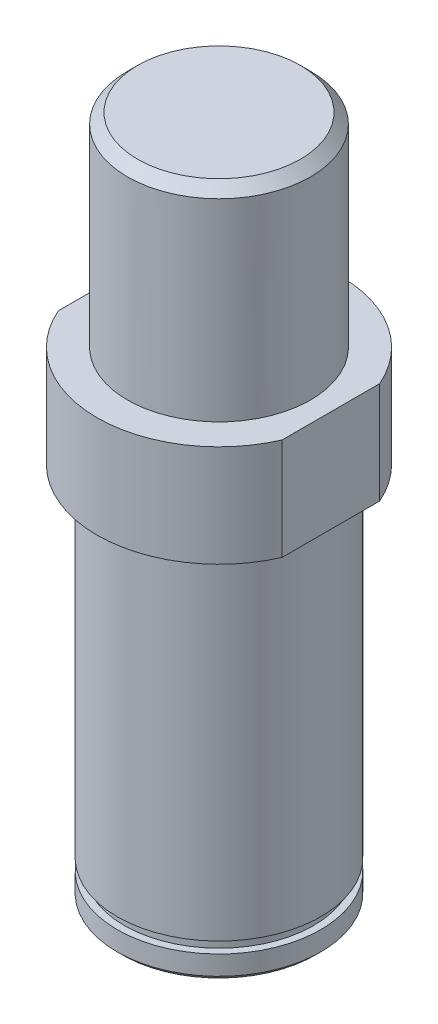
ISO-10303-21;
HEADER;
FILE_DESCRIPTION(('STEP AP214'),'2;1');
FILE_NAME('part.step','',(''),(''),'','','');
FILE_SCHEMA(('AUTOMOTIVE_DESIGN { 1 0 10303 214 1 1 1 1 }'));
ENDSEC;
DATA;
#1=APPLICATION_CONTEXT('core data for automotive mechanical design processes');
#2=APPLICATION_PROTOCOL_DEFINITION('international standard','automotive_design',2000,#1);
#3=PRODUCT_CONTEXT('',#1,'mechanical');
#4=PRODUCT('Part','Part','',(#3));
#5=PRODUCT_RELATED_PRODUCT_CATEGORY('part','',(#4));
#6=PRODUCT_DEFINITION_FORMATION('','',#4);
#7=PRODUCT_DEFINITION_CONTEXT('part definition',#1,'design');
#8=PRODUCT_DEFINITION('design','',#6,#7);
#9=PRODUCT_DEFINITION_SHAPE('','',#8);
#10=(LENGTH_UNIT() NAMED_UNIT(*) SI_UNIT(.MILLI.,.METRE.));
#11=(NAMED_UNIT(*) PLANE_ANGLE_UNIT() SI_UNIT($,.RADIAN.));
#12=(NAMED_UNIT(*) SI_UNIT($,.STERADIAN.) SOLID_ANGLE_UNIT());
#13=UNCERTAINTY_MEASURE_WITH_UNIT(LENGTH_MEASURE(1.E-05),#10,'distance_accuracy_value','');
#14=(GEOMETRIC_REPRESENTATION_CONTEXT(3) GLOBAL_UNCERTAINTY_ASSIGNED_CONTEXT((#13)) GLOBAL_UNIT_ASSIGNED_CONTEXT((#10,
#11,#12)) REPRESENTATION_CONTEXT('',''));
#15=CARTESIAN_POINT('',(0.,0.,0.));
#16=DIRECTION('',(0.,0.,1.));
#17=DIRECTION('',(1.,0.,0.));
#18=AXIS2_PLACEMENT_3D('',#15,#16,#17);
#19=CARTESIAN_POINT('',(0.,0.,0.));
#20=DIRECTION('',(0.,-1.,0.));
#21=DIRECTION('',(0.,0.,-1.));
#22=AXIS2_PLACEMENT_3D('',#19,#20,#21);
#23=CYLINDRICAL_SURFACE('',#22,10.);
#24=CARTESIAN_POINT('',(0.,22.,0.));
#25=DIRECTION('',(0.,-1.,0.));
#26=DIRECTION('',(0.,0.,-1.));
#27=AXIS2_PLACEMENT_3D('',#24,#25,#26);
#28=CIRCLE('',#27,9.99999999999999);
#29=CARTESIAN_POINT('',(0.,22.,-9.99999999999999));
#30=VERTEX_POINT('',#29);
#31=EDGE_CURVE('E106',#30,#30,#28,.T.);
#32=ORIENTED_EDGE('',*,*,#31,.T.);
#33=EDGE_LOOP('',(#32));
#34=FACE_BOUND('',#33,.T.);
#35=CARTESIAN_POINT('',(0.,-11.5,0.));
#36=DIRECTION('',(0.,1.,0.));
#37=DIRECTION('',(0.,0.,1.));
#38=AXIS2_PLACEMENT_3D('',#35,#36,#37);
#39=CIRCLE('',#38,10.);
#40=CARTESIAN_POINT('',(0.,-11.5,10.));
#41=VERTEX_POINT('',#40);
#42=EDGE_CURVE('E190',#41,#41,#39,.T.);
#43=ORIENTED_EDGE('',*,*,#42,.T.);
#44=EDGE_LOOP('',(#43));
#45=FACE_BOUND('',#44,.T.);
#46=ADVANCED_FACE('F37',(#34,#45),#23,.T.);
#47=CARTESIAN_POINT('',(0.,0.,0.));
#48=DIRECTION('',(0.,-1.,0.));
#49=DIRECTION('',(0.,0.,-1.));
#50=AXIS2_PLACEMENT_3D('',#47,#48,#49);
#51=CYLINDRICAL_SURFACE('',#50,12.);
#52=DIRECTION('',(0.,1.,0.));
#53=VECTOR('',#52,1.);
#54=CARTESIAN_POINT('',(11.,0.,-4.7958315233127));
#55=LINE('',#54,#53);
#56=CARTESIAN_POINT('',(11.,22.,-4.7958315233127));
#57=VERTEX_POINT('',#56);
#58=CARTESIAN_POINT('',(11.,32.,-4.7958315233127));
#59=VERTEX_POINT('',#58);
#60=EDGE_CURVE('E52',#57,#59,#55,.T.);
#61=ORIENTED_EDGE('',*,*,#60,.F.);
#62=CARTESIAN_POINT('',(0.,22.,0.));
#63=DIRECTION('',(0.,-1.,0.));
#64=DIRECTION('',(0.,0.,-1.));
#65=AXIS2_PLACEMENT_3D('',#62,#63,#64);
#66=CIRCLE('',#65,12.);
#67=CARTESIAN_POINT('',(-11.,22.,-4.79583152331271));
#68=VERTEX_POINT('',#67);
#69=EDGE_CURVE('E103',#68,#57,#66,.T.);
#70=ORIENTED_EDGE('',*,*,#69,.F.);
#71=DIRECTION('',(0.,1.,0.));
#72=VECTOR('',#71,1.);
#73=CARTESIAN_POINT('',(-11.,0.,-4.79583152331271));
#74=LINE('',#73,#72);
#75=CARTESIAN_POINT('',(-11.,32.,-4.79583152331271));
#76=VERTEX_POINT('',#75);
#77=EDGE_CURVE('E202',#68,#76,#74,.T.);
#78=ORIENTED_EDGE('',*,*,#77,.T.);
#79=CARTESIAN_POINT('',(0.,32.,0.));
#80=DIRECTION('',(0.,-1.,0.));
#81=DIRECTION('',(0.,0.,-1.));
#82=AXIS2_PLACEMENT_3D('',#79,#80,#81);
#83=CIRCLE('',#82,12.);
#84=EDGE_CURVE('E95',#76,#59,#83,.T.);
#85=ORIENTED_EDGE('',*,*,#84,.T.);
#86=EDGE_LOOP('',(#61,#70,#78,#85));
#87=FACE_BOUND('',#86,.T.);
#88=ADVANCED_FACE('F132',(#87),#51,.T.);
#89=CARTESIAN_POINT('',(12.,22.,0.));
#90=DIRECTION('',(0.,-1.,0.));
#91=DIRECTION('',(0.,0.,-1.));
#92=AXIS2_PLACEMENT_3D('',#89,#90,#91);
#93=PLANE('',#92);
#94=DIRECTION('',(0.,0.,-1.));
#95=VECTOR('',#94,1.);
#96=CARTESIAN_POINT('',(11.,22.,0.));
#97=LINE('',#96,#95);
#98=CARTESIAN_POINT('',(11.,22.,4.7958315233127));
#99=VERTEX_POINT('',#98);
#100=EDGE_CURVE('E89',#99,#57,#97,.T.);
#101=ORIENTED_EDGE('',*,*,#100,.F.);
#102=CARTESIAN_POINT('',(-11.,22.,4.79583152331271));
#103=VERTEX_POINT('',#102);
#104=EDGE_CURVE('E88',#99,#103,#66,.T.);
#105=ORIENTED_EDGE('',*,*,#104,.T.);
#106=DIRECTION('',(0.,0.,-1.));
#107=VECTOR('',#106,1.);
#108=CARTESIAN_POINT('',(-11.,22.,0.));
#109=LINE('',#108,#107);
#110=EDGE_CURVE('E99',#103,#68,#109,.T.);
#111=ORIENTED_EDGE('',*,*,#110,.T.);
#112=ORIENTED_EDGE('',*,*,#69,.T.);
#113=EDGE_LOOP('',(#101,#105,#111,#112));
#114=FACE_BOUND('',#113,.T.);
#115=ORIENTED_EDGE('',*,*,#31,.F.);
#116=EDGE_LOOP('',(#115));
#117=FACE_BOUND('',#116,.T.);
#118=ADVANCED_FACE('F137',(#114,#117),#93,.T.);
#119=DIRECTION('',(0.,1.,0.));
#120=VECTOR('',#119,1.);
#121=CARTESIAN_POINT('',(11.,0.,4.7958315233127));
#122=LINE('',#121,#120);
#123=CARTESIAN_POINT('',(11.,32.,4.7958315233127));
#124=VERTEX_POINT('',#123);
#125=EDGE_CURVE('E79',#99,#124,#122,.T.);
#126=ORIENTED_EDGE('',*,*,#125,.T.);
#127=CARTESIAN_POINT('',(-11.,32.,4.79583152331271));
#128=VERTEX_POINT('',#127);
#129=EDGE_CURVE('E60',#124,#128,#83,.T.);
#130=ORIENTED_EDGE('',*,*,#129,.T.);
#131=DIRECTION('',(0.,1.,0.));
#132=VECTOR('',#131,1.);
#133=CARTESIAN_POINT('',(-11.,0.,4.79583152331271));
#134=LINE('',#133,#132);
#135=EDGE_CURVE('E203',#103,#128,#134,.T.);
#136=ORIENTED_EDGE('',*,*,#135,.F.);
#137=ORIENTED_EDGE('',*,*,#104,.F.);
#138=EDGE_LOOP('',(#126,#130,#136,#137));
#139=FACE_BOUND('',#138,.T.);
#140=ADVANCED_FACE('F87',(#139),#51,.T.);
#141=CARTESIAN_POINT('',(9.00000000000001,32.,0.));
#142=DIRECTION('',(0.,1.,0.));
#143=DIRECTION('',(0.,0.,1.));
#144=AXIS2_PLACEMENT_3D('',#141,#142,#143);
#145=PLANE('',#144);
#146=DIRECTION('',(0.,0.,1.));
#147=VECTOR('',#146,1.);
#148=CARTESIAN_POINT('',(11.,32.,0.));
#149=LINE('',#148,#147);
#150=EDGE_CURVE('E77',#59,#124,#149,.T.);
#151=ORIENTED_EDGE('',*,*,#150,.F.);
#152=ORIENTED_EDGE('',*,*,#84,.F.);
#153=DIRECTION('',(0.,0.,1.));
#154=VECTOR('',#153,1.);
#155=CARTESIAN_POINT('',(-11.,32.,0.));
#156=LINE('',#155,#154);
#157=EDGE_CURVE('E94',#76,#128,#156,.T.);
#158=ORIENTED_EDGE('',*,*,#157,.T.);
#159=ORIENTED_EDGE('',*,*,#129,.F.);
#160=EDGE_LOOP('',(#151,#152,#158,#159));
#161=FACE_BOUND('',#160,.T.);
#162=CARTESIAN_POINT('',(0.,32.,0.));
#163=DIRECTION('',(0.,-1.,0.));
#164=DIRECTION('',(0.,0.,-1.));
#165=AXIS2_PLACEMENT_3D('',#162,#163,#164);
#166=CIRCLE('',#165,9.00000000000001);
#167=CARTESIAN_POINT('',(0.,32.,-9.00000000000001));
#168=VERTEX_POINT('',#167);
#169=EDGE_CURVE('E96',#168,#168,#166,.T.);
#170=ORIENTED_EDGE('',*,*,#169,.T.);
#171=EDGE_LOOP('',(#170));
#172=FACE_BOUND('',#171,.T.);
#173=ADVANCED_FACE('F92',(#161,#172),#145,.T.);
#174=CARTESIAN_POINT('',(0.,0.,0.));
#175=DIRECTION('',(0.,-1.,0.));
#176=DIRECTION('',(0.,0.,-1.));
#177=AXIS2_PLACEMENT_3D('',#174,#175,#176);
#178=CYLINDRICAL_SURFACE('',#177,9.);
#179=CARTESIAN_POINT('',(0.,51.,0.));
#180=DIRECTION('',(0.,1.,0.));
#181=DIRECTION('',(0.,0.,1.));
#182=AXIS2_PLACEMENT_3D('',#179,#180,#181);
#183=CIRCLE('',#182,9.);
#184=CARTESIAN_POINT('',(0.,51.,9.));
#185=VERTEX_POINT('',#184);
#186=EDGE_CURVE('E109',#185,#185,#183,.F.);
#187=ORIENTED_EDGE('',*,*,#186,.T.);
#188=EDGE_LOOP('',(#187));
#189=FACE_BOUND('',#188,.T.);
#190=ORIENTED_EDGE('',*,*,#169,.F.);
#191=EDGE_LOOP('',(#190));
#192=FACE_BOUND('',#191,.T.);
#193=ADVANCED_FACE('F153',(#189,#192),#178,.T.);
#194=CARTESIAN_POINT('',(9.,52.,0.));
#195=DIRECTION('',(0.,1.,0.));
#196=DIRECTION('',(0.,0.,1.));
#197=AXIS2_PLACEMENT_3D('',#194,#195,#196);
#198=PLANE('',#197);
#199=CARTESIAN_POINT('',(0.,52.,0.));
#200=DIRECTION('',(0.,1.,0.));
#201=DIRECTION('',(0.,0.,1.));
#202=AXIS2_PLACEMENT_3D('',#199,#200,#201);
#203=CIRCLE('',#202,7.99999999999998);
#204=CARTESIAN_POINT('',(0.,52.,7.99999999999998));
#205=VERTEX_POINT('',#204);
#206=EDGE_CURVE('E112',#205,#205,#203,.T.);
#207=ORIENTED_EDGE('',*,*,#206,.T.);
#208=EDGE_LOOP('',(#207));
#209=FACE_BOUND('',#208,.T.);
#210=ADVANCED_FACE('F145',(#209),#198,.T.);
#211=CARTESIAN_POINT('',(0.,51.,0.));
#212=DIRECTION('',(0.,-1.,0.));
#213=DIRECTION('',(0.,0.,-1.));
#214=AXIS2_PLACEMENT_3D('',#211,#212,#213);
#215=CONICAL_SURFACE('',#214,9.,0.785398163397459);
#216=ORIENTED_EDGE('',*,*,#206,.F.);
#217=EDGE_LOOP('',(#216));
#218=FACE_BOUND('',#217,.T.);
#219=ORIENTED_EDGE('',*,*,#186,.F.);
#220=EDGE_LOOP('',(#219));
#221=FACE_BOUND('',#220,.T.);
#222=ADVANCED_FACE('F142',(#218,#221),#215,.T.);
#223=CARTESIAN_POINT('',(-11.,0.,0.));
#224=DIRECTION('',(-1.,0.,0.));
#225=DIRECTION('',(0.,0.,1.));
#226=AXIS2_PLACEMENT_3D('',#223,#224,#225);
#227=PLANE('',#226);
#228=ORIENTED_EDGE('',*,*,#135,.T.);
#229=ORIENTED_EDGE('',*,*,#157,.F.);
#230=ORIENTED_EDGE('',*,*,#77,.F.);
#231=ORIENTED_EDGE('',*,*,#110,.F.);
#232=EDGE_LOOP('',(#228,#229,#230,#231));
#233=FACE_BOUND('',#232,.T.);
#234=ADVANCED_FACE('F144',(#233),#227,.T.);
#235=CARTESIAN_POINT('',(11.,0.,0.));
#236=DIRECTION('',(-1.,0.,0.));
#237=DIRECTION('',(0.,0.,1.));
#238=AXIS2_PLACEMENT_3D('',#235,#236,#237);
#239=PLANE('',#238);
#240=ORIENTED_EDGE('',*,*,#100,.T.);
#241=ORIENTED_EDGE('',*,*,#60,.T.);
#242=ORIENTED_EDGE('',*,*,#150,.T.);
#243=ORIENTED_EDGE('',*,*,#125,.F.);
#244=EDGE_LOOP('',(#240,#241,#242,#243));
#245=FACE_BOUND('',#244,.T.);
#246=ADVANCED_FACE('F78',(#245),#239,.F.);
#247=CARTESIAN_POINT('',(0.,-12.6,-10.));
#248=DIRECTION('',(0.,1.,0.));
#249=DIRECTION('',(0.,0.,1.));
#250=AXIS2_PLACEMENT_3D('',#247,#248,#249);
#251=PLANE('',#250);
#252=CARTESIAN_POINT('',(0.,-12.6,0.));
#253=DIRECTION('',(0.,1.,0.));
#254=DIRECTION('',(0.,0.,1.));
#255=AXIS2_PLACEMENT_3D('',#252,#253,#254);
#256=CIRCLE('',#255,10.);
#257=CARTESIAN_POINT('',(0.,-12.6,10.));
#258=VERTEX_POINT('',#257);
#259=EDGE_CURVE('E84',#258,#258,#256,.T.);
#260=ORIENTED_EDGE('',*,*,#259,.T.);
#261=EDGE_LOOP('',(#260));
#262=FACE_BOUND('',#261,.T.);
#263=CARTESIAN_POINT('',(0.,-12.6,0.));
#264=DIRECTION('',(0.,1.,0.));
#265=DIRECTION('',(0.,0.,1.));
#266=AXIS2_PLACEMENT_3D('',#263,#264,#265);
#267=CIRCLE('',#266,9.30000000000001);
#268=CARTESIAN_POINT('',(0.,-12.6,9.30000000000001));
#269=VERTEX_POINT('',#268);
#270=EDGE_CURVE('E192',#269,#269,#267,.T.);
#271=ORIENTED_EDGE('',*,*,#270,.F.);
#272=EDGE_LOOP('',(#271));
#273=FACE_BOUND('',#272,.T.);
#274=ADVANCED_FACE('F171',(#262,#273),#251,.T.);
#275=CARTESIAN_POINT('',(0.,52.,0.));
#276=DIRECTION('',(0.,1.,0.));
#277=DIRECTION('',(0.,0.,1.));
#278=AXIS2_PLACEMENT_3D('',#275,#276,#277);
#279=CYLINDRICAL_SURFACE('',#278,9.30000000000001);
#280=ORIENTED_EDGE('',*,*,#270,.T.);
#281=EDGE_LOOP('',(#280));
#282=FACE_BOUND('',#281,.T.);
#283=CARTESIAN_POINT('',(0.,-11.5,0.));
#284=DIRECTION('',(0.,1.,0.));
#285=DIRECTION('',(0.,0.,1.));
#286=AXIS2_PLACEMENT_3D('',#283,#284,#285);
#287=CIRCLE('',#286,9.30000000000001);
#288=CARTESIAN_POINT('',(0.,-11.5,9.30000000000001));
#289=VERTEX_POINT('',#288);
#290=EDGE_CURVE('E187',#289,#289,#287,.T.);
#291=ORIENTED_EDGE('',*,*,#290,.F.);
#292=EDGE_LOOP('',(#291));
#293=FACE_BOUND('',#292,.T.);
#294=ADVANCED_FACE('F175',(#282,#293),#279,.T.);
#295=CARTESIAN_POINT('',(0.,-11.5,-10.));
#296=DIRECTION('',(0.,-1.,0.));
#297=DIRECTION('',(0.,0.,-1.));
#298=AXIS2_PLACEMENT_3D('',#295,#296,#297);
#299=PLANE('',#298);
#300=ORIENTED_EDGE('',*,*,#290,.T.);
#301=EDGE_LOOP('',(#300));
#302=FACE_BOUND('',#301,.T.);
#303=ORIENTED_EDGE('',*,*,#42,.F.);
#304=EDGE_LOOP('',(#303));
#305=FACE_BOUND('',#304,.T.);
#306=ADVANCED_FACE('F128',(#302,#305),#299,.T.);
#307=CARTESIAN_POINT('',(0.,-15.,0.));
#308=DIRECTION('',(0.,-1.,0.));
#309=DIRECTION('',(0.,0.,-1.));
#310=AXIS2_PLACEMENT_3D('',#307,#308,#309);
#311=PLANE('',#310);
#312=CARTESIAN_POINT('',(0.,-15.,0.));
#313=DIRECTION('',(0.,-1.,0.));
#314=DIRECTION('',(0.,0.,-1.));
#315=AXIS2_PLACEMENT_3D('',#312,#313,#314);
#316=CIRCLE('',#315,9.49999999999999);
#317=CARTESIAN_POINT('',(0.,-15.,-9.49999999999999));
#318=VERTEX_POINT('',#317);
#319=EDGE_CURVE('E45',#318,#318,#316,.T.);
#320=ORIENTED_EDGE('',*,*,#319,.T.);
#321=EDGE_LOOP('',(#320));
#322=FACE_BOUND('',#321,.T.);
#323=ADVANCED_FACE('F117',(#322),#311,.T.);
#324=CARTESIAN_POINT('',(0.,-15.,0.));
#325=DIRECTION('',(0.,1.,0.));
#326=DIRECTION('',(0.,0.,1.));
#327=AXIS2_PLACEMENT_3D('',#324,#325,#326);
#328=CONICAL_SURFACE('',#327,9.49999999999999,0.785398163397448);
#329=CARTESIAN_POINT('',(0.,-14.5,0.));
#330=DIRECTION('',(0.,-1.,0.));
#331=DIRECTION('',(0.,0.,-1.));
#332=AXIS2_PLACEMENT_3D('',#329,#330,#331);
#333=CIRCLE('',#332,10.);
#334=CARTESIAN_POINT('',(0.,-14.5,-10.));
#335=VERTEX_POINT('',#334);
#336=EDGE_CURVE('E11',#335,#335,#333,.F.);
#337=ORIENTED_EDGE('',*,*,#336,.F.);
#338=EDGE_LOOP('',(#337));
#339=FACE_BOUND('',#338,.T.);
#340=ORIENTED_EDGE('',*,*,#319,.F.);
#341=EDGE_LOOP('',(#340));
#342=FACE_BOUND('',#341,.T.);
#343=ADVANCED_FACE('F39',(#339,#342),#328,.T.);
#344=ORIENTED_EDGE('',*,*,#336,.T.);
#345=EDGE_LOOP('',(#344));
#346=FACE_BOUND('',#345,.T.);
#347=ORIENTED_EDGE('',*,*,#259,.F.);
#348=EDGE_LOOP('',(#347));
#349=FACE_BOUND('',#348,.T.);
#350=ADVANCED_FACE('F120',(#346,#349),#23,.T.);
#351=CLOSED_SHELL('',(#46,#88,#118,#140,#173,#193,#210,#222,#234,#246,#274,#294,#306,#323,#343,#350));
#352=MANIFOLD_SOLID_BREP('B2',#351);
#353=ADVANCED_BREP_SHAPE_REPRESENTATION('',(#18,#352),#14);
#354=SHAPE_DEFINITION_REPRESENTATION(#9,#353);
ENDSEC;
END-ISO-10303-21;
